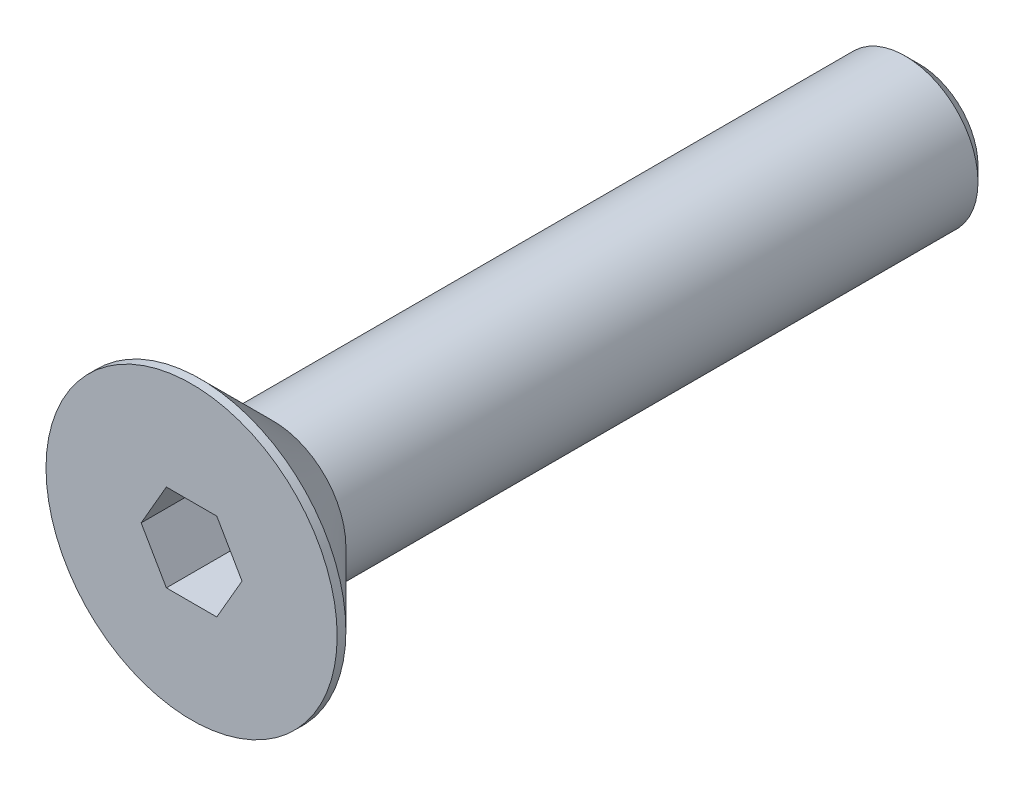
ISO-10303-21;
HEADER;
FILE_DESCRIPTION(('STEP AP214'),'2;1');
FILE_NAME('part.step','',(''),(''),'','','');
FILE_SCHEMA(('AUTOMOTIVE_DESIGN { 1 0 10303 214 1 1 1 1 }'));
ENDSEC;
DATA;
#1=APPLICATION_CONTEXT('core data for automotive mechanical design processes');
#2=APPLICATION_PROTOCOL_DEFINITION('international standard','automotive_design',2000,#1);
#3=PRODUCT_CONTEXT('',#1,'mechanical');
#4=PRODUCT('Part','Part','',(#3));
#5=PRODUCT_RELATED_PRODUCT_CATEGORY('part','',(#4));
#6=PRODUCT_DEFINITION_FORMATION('','',#4);
#7=PRODUCT_DEFINITION_CONTEXT('part definition',#1,'design');
#8=PRODUCT_DEFINITION('design','',#6,#7);
#9=PRODUCT_DEFINITION_SHAPE('','',#8);
#10=(LENGTH_UNIT() NAMED_UNIT(*) SI_UNIT(.MILLI.,.METRE.));
#11=(NAMED_UNIT(*) PLANE_ANGLE_UNIT() SI_UNIT($,.RADIAN.));
#12=(NAMED_UNIT(*) SI_UNIT($,.STERADIAN.) SOLID_ANGLE_UNIT());
#13=UNCERTAINTY_MEASURE_WITH_UNIT(LENGTH_MEASURE(1.E-05),#10,'distance_accuracy_value','');
#14=(GEOMETRIC_REPRESENTATION_CONTEXT(3) GLOBAL_UNCERTAINTY_ASSIGNED_CONTEXT((#13)) GLOBAL_UNIT_ASSIGNED_CONTEXT((#10,
#11,#12)) REPRESENTATION_CONTEXT('',''));
#15=CARTESIAN_POINT('',(0.,0.,0.));
#16=DIRECTION('',(0.,0.,1.));
#17=DIRECTION('',(1.,0.,0.));
#18=AXIS2_PLACEMENT_3D('',#15,#16,#17);
#19=CARTESIAN_POINT('',(-3.88578058618805E-13,4.44089209850063E-13,2.80000000000058));
#20=DIRECTION('',(0.,0.,1.));
#21=DIRECTION('',(-1.00000000000003,0.,0.));
#22=AXIS2_PLACEMENT_3D('',#19,#20,#21);
#23=PLANE('',#22);
#24=CARTESIAN_POINT('',(-3.88578058618805E-13,4.44089209850063E-13,2.80000000000058));
#25=DIRECTION('',(0.,0.,1.));
#26=DIRECTION('',(1.00000000000003,0.,0.));
#27=AXIS2_PLACEMENT_3D('',#24,#25,#26);
#28=CIRCLE('',#27,5.);
#29=CARTESIAN_POINT('',(5.00000000000045,-1.66533453693773E-12,2.80000000000047));
#30=VERTEX_POINT('',#29);
#31=EDGE_CURVE('E11',#30,#30,#28,.T.);
#32=ORIENTED_EDGE('',*,*,#31,.T.);
#33=EDGE_LOOP('',(#32));
#34=FACE_BOUND('',#33,.T.);
#35=DIRECTION('',(-1.00000000000003,0.,0.));
#36=VECTOR('',#35,1.);
#37=CARTESIAN_POINT('',(0.216506350949941,-1.50000000000161,2.79999999999947));
#38=LINE('',#37,#36);
#39=CARTESIAN_POINT('',(0.86602540379932,-1.5000000000015,2.7999999999993));
#40=VERTEX_POINT('',#39);
#41=CARTESIAN_POINT('',(-0.866025403799708,-1.50000000000106,2.79999999999914));
#42=VERTEX_POINT('',#41);
#43=EDGE_CURVE('E97',#40,#42,#38,.T.);
#44=ORIENTED_EDGE('',*,*,#43,.T.);
#45=DIRECTION('',(-0.500000000006758,0.866025403780579,0.));
#46=VECTOR('',#45,1.);
#47=CARTESIAN_POINT('',(-1.29903810569393,-0.75000000001102,2.7999999999993));
#48=LINE('',#47,#46);
#49=CARTESIAN_POINT('',(-1.73205080759931,1.11022302462516E-13,2.80000000000152));
#50=VERTEX_POINT('',#49);
#51=EDGE_CURVE('E157',#42,#50,#48,.T.);
#52=ORIENTED_EDGE('',*,*,#51,.T.);
#53=DIRECTION('',(0.500000000006745,0.866025403780568,0.));
#54=VECTOR('',#53,1.);
#55=CARTESIAN_POINT('',(-1.29903810569465,0.750000000008244,2.79999999999903));
#56=LINE('',#55,#54);
#57=CARTESIAN_POINT('',(-0.866025403799209,1.49999999999773,2.79999999999969));
#58=VERTEX_POINT('',#57);
#59=EDGE_CURVE('E142',#50,#58,#56,.T.);
#60=ORIENTED_EDGE('',*,*,#59,.T.);
#61=DIRECTION('',(1.00000000000003,0.,0.));
#62=VECTOR('',#61,1.);
#63=CARTESIAN_POINT('',(1.66533453693773E-13,1.49999999999773,2.79999999999991));
#64=LINE('',#63,#62);
#65=CARTESIAN_POINT('',(0.866025403799375,1.49999999999872,2.80000000000075));
#66=VERTEX_POINT('',#65);
#67=EDGE_CURVE('E131',#58,#66,#64,.T.);
#68=ORIENTED_EDGE('',*,*,#67,.T.);
#69=DIRECTION('',(0.500000000006758,-0.866025403780579,0.));
#70=VECTOR('',#69,1.);
#71=CARTESIAN_POINT('',(1.29903810569393,0.750000000010798,2.80000000000052));
#72=LINE('',#71,#70);
#73=CARTESIAN_POINT('',(1.73205080759986,-5.55111512312578E-13,2.79999999999986));
#74=VERTEX_POINT('',#73);
#75=EDGE_CURVE('E168',#66,#74,#72,.T.);
#76=ORIENTED_EDGE('',*,*,#75,.T.);
#77=DIRECTION('',(-0.500000000006745,-0.866025403780568,0.));
#78=VECTOR('',#77,1.);
#79=CARTESIAN_POINT('',(1.29903810569421,-0.750000000010242,2.80000000000041));
#80=LINE('',#79,#78);
#81=EDGE_CURVE('E20',#74,#40,#80,.T.);
#82=ORIENTED_EDGE('',*,*,#81,.T.);
#83=EDGE_LOOP('',(#44,#52,#60,#68,#76,#82));
#84=FACE_BOUND('',#83,.T.);
#85=ADVANCED_FACE('F16',(#34,#84),#23,.T.);
#86=CARTESIAN_POINT('',(-1.22124532708767E-12,-1.33226762955019E-12,1.40000000000023));
#87=DIRECTION('',(0.,0.,1.));
#88=DIRECTION('',(1.00000000000003,0.,0.));
#89=AXIS2_PLACEMENT_3D('',#86,#87,#88);
#90=CYLINDRICAL_SURFACE('',#89,5.);
#91=ORIENTED_EDGE('',*,*,#31,.F.);
#92=EDGE_LOOP('',(#91));
#93=FACE_BOUND('',#92,.T.);
#94=CARTESIAN_POINT('',(-2.22044604925031E-13,-1.55431223447522E-12,2.49999999999984));
#95=DIRECTION('',(0.,0.,1.));
#96=DIRECTION('',(1.00000000000003,0.,0.));
#97=AXIS2_PLACEMENT_3D('',#94,#95,#96);
#98=CIRCLE('',#97,5.);
#99=CARTESIAN_POINT('',(4.99999999999956,-1.4432899320127E-12,2.49999999999928));
#100=VERTEX_POINT('',#99);
#101=EDGE_CURVE('E27',#100,#100,#98,.T.);
#102=ORIENTED_EDGE('',*,*,#101,.T.);
#103=EDGE_LOOP('',(#102));
#104=FACE_BOUND('',#103,.T.);
#105=ADVANCED_FACE('F189',(#93,#104),#90,.T.);
#106=CARTESIAN_POINT('',(-3.88578058618805E-13,-2.66453525910038E-12,1.2499999999992));
#107=DIRECTION('',(0.,0.,1.));
#108=DIRECTION('',(1.00000000000003,0.,0.));
#109=AXIS2_PLACEMENT_3D('',#106,#107,#108);
#110=CONICAL_SURFACE('',#109,3.75,0.785398163397448);
#111=CARTESIAN_POINT('',(0.,0.,0.));
#112=DIRECTION('',(0.,0.,-1.));
#113=DIRECTION('',(1.00000000000003,0.,0.));
#114=AXIS2_PLACEMENT_3D('',#111,#112,#113);
#115=CIRCLE('',#114,2.5);
#116=CARTESIAN_POINT('',(2.50000000000172,2.22044604925031E-13,-6.10622663543836E-13));
#117=VERTEX_POINT('',#116);
#118=EDGE_CURVE('E136',#117,#117,#115,.T.);
#119=ORIENTED_EDGE('',*,*,#118,.F.);
#120=EDGE_LOOP('',(#119));
#121=FACE_BOUND('',#120,.T.);
#122=ORIENTED_EDGE('',*,*,#101,.F.);
#123=EDGE_LOOP('',(#122));
#124=FACE_BOUND('',#123,.T.);
#125=ADVANCED_FACE('F18',(#121,#124),#110,.T.);
#126=CARTESIAN_POINT('',(-4.9960036108132E-13,-9.99200722162641E-13,-22.1999999999994));
#127=DIRECTION('',(0.,0.,-1.));
#128=DIRECTION('',(1.00000000000003,0.,0.));
#129=AXIS2_PLACEMENT_3D('',#126,#127,#128);
#130=PLANE('',#129);
#131=CARTESIAN_POINT('',(-4.9960036108132E-13,-9.99200722162641E-13,-22.1999999999994));
#132=DIRECTION('',(0.,0.,-1.));
#133=DIRECTION('',(1.00000000000003,0.,0.));
#134=AXIS2_PLACEMENT_3D('',#131,#132,#133);
#135=CIRCLE('',#134,2.00925);
#136=CARTESIAN_POINT('',(2.00924999999996,-8.88178419700125E-13,-22.2000000000003));
#137=VERTEX_POINT('',#136);
#138=EDGE_CURVE('E60',#137,#137,#135,.T.);
#139=ORIENTED_EDGE('',*,*,#138,.T.);
#140=EDGE_LOOP('',(#139));
#141=FACE_BOUND('',#140,.T.);
#142=ADVANCED_FACE('F206',(#141),#130,.T.);
#143=CARTESIAN_POINT('',(-1.11022302462516E-13,1.22124532708767E-12,-9.69999999999987));
#144=DIRECTION('',(0.,0.,1.));
#145=DIRECTION('',(1.00000000000003,0.,0.));
#146=AXIS2_PLACEMENT_3D('',#143,#144,#145);
#147=CYLINDRICAL_SURFACE('',#146,2.5);
#148=ORIENTED_EDGE('',*,*,#118,.T.);
#149=EDGE_LOOP('',(#148));
#150=FACE_BOUND('',#149,.T.);
#151=CARTESIAN_POINT('',(-3.33066907387547E-13,-3.33066907387547E-13,-21.7092499999997));
#152=DIRECTION('',(0.,0.,1.));
#153=DIRECTION('',(1.00000000000003,0.,0.));
#154=AXIS2_PLACEMENT_3D('',#151,#152,#153);
#155=CIRCLE('',#154,2.5);
#156=CARTESIAN_POINT('',(2.50000000000039,6.66133814775094E-13,-21.7092499999993));
#157=VERTEX_POINT('',#156);
#158=EDGE_CURVE('E67',#157,#157,#155,.T.);
#159=ORIENTED_EDGE('',*,*,#158,.T.);
#160=EDGE_LOOP('',(#159));
#161=FACE_BOUND('',#160,.T.);
#162=ADVANCED_FACE('F202',(#150,#161),#147,.T.);
#163=CARTESIAN_POINT('',(-8.32667268468867E-13,-2.22044604925031E-13,-21.9546250000011));
#164=DIRECTION('',(0.,0.,1.));
#165=DIRECTION('',(1.00000000000003,0.,0.));
#166=AXIS2_PLACEMENT_3D('',#163,#164,#165);
#167=CONICAL_SURFACE('',#166,2.254625,0.78539816339745);
#168=ORIENTED_EDGE('',*,*,#138,.F.);
#169=EDGE_LOOP('',(#168));
#170=FACE_BOUND('',#169,.T.);
#171=ORIENTED_EDGE('',*,*,#158,.F.);
#172=EDGE_LOOP('',(#171));
#173=FACE_BOUND('',#172,.T.);
#174=ADVANCED_FACE('F205',(#170,#173),#167,.T.);
#175=CARTESIAN_POINT('',(5.55111512312578E-13,-9.99200722162641E-13,0.499999999998724));
#176=DIRECTION('',(0.,0.,-1.));
#177=DIRECTION('',(0.,-1.00000000000003,0.));
#178=AXIS2_PLACEMENT_3D('',#175,#176,#177);
#179=PLANE('',#178);
#180=DIRECTION('',(1.00000000000003,0.,0.));
#181=VECTOR('',#180,1.);
#182=CARTESIAN_POINT('',(-1.11022302462516E-13,-1.50000000000006,0.500000000000111));
#183=LINE('',#182,#181);
#184=CARTESIAN_POINT('',(-0.866025403799209,-1.50000000000206,0.49999999999939));
#185=VERTEX_POINT('',#184);
#186=CARTESIAN_POINT('',(0.866025403800263,-1.50000000000095,0.499999999999834));
#187=VERTEX_POINT('',#186);
#188=EDGE_CURVE('E84',#185,#187,#183,.T.);
#189=ORIENTED_EDGE('',*,*,#188,.T.);
#190=DIRECTION('',(0.500000000006745,0.866025403780568,0.));
#191=VECTOR('',#190,1.);
#192=CARTESIAN_POINT('',(1.73205080759969,-5.55111512312578E-13,0.499999999999778));
#193=LINE('',#192,#191);
#194=CARTESIAN_POINT('',(1.73205080759969,-5.55111512312578E-13,0.499999999999778));
#195=VERTEX_POINT('',#194);
#196=EDGE_CURVE('E88',#187,#195,#193,.T.);
#197=ORIENTED_EDGE('',*,*,#196,.T.);
#198=DIRECTION('',(-0.500000000006758,0.866025403780577,0.));
#199=VECTOR('',#198,1.);
#200=CARTESIAN_POINT('',(0.866025403799819,1.4999999999995,0.500000000000111));
#201=LINE('',#200,#199);
#202=CARTESIAN_POINT('',(0.866025403799819,1.4999999999995,0.500000000000111));
#203=VERTEX_POINT('',#202);
#204=EDGE_CURVE('E128',#195,#203,#201,.T.);
#205=ORIENTED_EDGE('',*,*,#204,.T.);
#206=DIRECTION('',(-1.00000000000003,0.,0.));
#207=VECTOR('',#206,1.);
#208=CARTESIAN_POINT('',(-0.866025403799819,1.4999999999985,0.499999999999279));
#209=LINE('',#208,#207);
#210=CARTESIAN_POINT('',(-0.866025403799819,1.4999999999985,0.499999999999279));
#211=VERTEX_POINT('',#210);
#212=EDGE_CURVE('E120',#203,#211,#209,.T.);
#213=ORIENTED_EDGE('',*,*,#212,.T.);
#214=DIRECTION('',(-0.500000000006745,-0.866025403780568,0.));
#215=VECTOR('',#214,1.);
#216=CARTESIAN_POINT('',(-1.73205080759942,-9.99200722162641E-13,0.499999999999279));
#217=LINE('',#216,#215);
#218=CARTESIAN_POINT('',(-1.73205080759942,-9.99200722162641E-13,0.499999999999279));
#219=VERTEX_POINT('',#218);
#220=EDGE_CURVE('E141',#211,#219,#217,.T.);
#221=ORIENTED_EDGE('',*,*,#220,.T.);
#222=DIRECTION('',(0.500000000006758,-0.866025403780577,0.));
#223=VECTOR('',#222,1.);
#224=CARTESIAN_POINT('',(-0.866025403799209,-1.50000000000206,0.49999999999939));
#225=LINE('',#224,#223);
#226=EDGE_CURVE('E91',#219,#185,#225,.T.);
#227=ORIENTED_EDGE('',*,*,#226,.T.);
#228=EDGE_LOOP('',(#189,#197,#205,#213,#221,#227));
#229=FACE_BOUND('',#228,.T.);
#230=ADVANCED_FACE('F86',(#229),#179,.F.);
#231=CARTESIAN_POINT('',(-1.29903810570087,-0.750000000000806,3.80000000000086));
#232=DIRECTION('',(-0.866025403780567,-0.500000000006743,0.));
#233=DIRECTION('',(-0.500000000006758,0.866025403780579,0.));
#234=AXIS2_PLACEMENT_3D('',#231,#232,#233);
#235=PLANE('',#234);
#236=ORIENTED_EDGE('',*,*,#51,.F.);
#237=DIRECTION('',(0.,0.,-1.));
#238=VECTOR('',#237,1.);
#239=CARTESIAN_POINT('',(-0.866025403801041,-1.50000000000095,3.80000000000003));
#240=LINE('',#239,#238);
#241=EDGE_CURVE('E96',#42,#185,#240,.T.);
#242=ORIENTED_EDGE('',*,*,#241,.T.);
#243=ORIENTED_EDGE('',*,*,#226,.F.);
#244=DIRECTION('',(0.,0.,-1.));
#245=VECTOR('',#244,1.);
#246=CARTESIAN_POINT('',(-1.73205080760108,-3.33066907387547E-13,3.7999999999988));
#247=LINE('',#246,#245);
#248=EDGE_CURVE('E138',#50,#219,#247,.T.);
#249=ORIENTED_EDGE('',*,*,#248,.F.);
#250=EDGE_LOOP('',(#236,#242,#243,#249));
#251=FACE_BOUND('',#250,.T.);
#252=ADVANCED_FACE('F187',(#251),#235,.F.);
#253=CARTESIAN_POINT('',(-1.29903810569942,0.749999999998252,3.79999999999941));
#254=DIRECTION('',(-0.866025403780575,0.500000000006762,0.));
#255=DIRECTION('',(0.500000000006747,0.866025403780568,0.));
#256=AXIS2_PLACEMENT_3D('',#253,#254,#255);
#257=PLANE('',#256);
#258=ORIENTED_EDGE('',*,*,#59,.F.);
#259=ORIENTED_EDGE('',*,*,#248,.T.);
#260=ORIENTED_EDGE('',*,*,#220,.F.);
#261=DIRECTION('',(0.,0.,-1.));
#262=VECTOR('',#261,1.);
#263=CARTESIAN_POINT('',(-0.866025403798765,1.49999999999839,3.80000000000036));
#264=LINE('',#263,#262);
#265=EDGE_CURVE('E125',#58,#211,#264,.T.);
#266=ORIENTED_EDGE('',*,*,#265,.F.);
#267=EDGE_LOOP('',(#258,#259,#260,#266));
#268=FACE_BOUND('',#267,.T.);
#269=ADVANCED_FACE('F186',(#268),#257,.F.);
#270=CARTESIAN_POINT('',(0.43301270190077,-1.50000000000161,3.80000000000019));
#271=DIRECTION('',(0.,-1.00000000000003,0.));
#272=DIRECTION('',(-1.00000000000003,0.,0.));
#273=AXIS2_PLACEMENT_3D('',#270,#271,#272);
#274=PLANE('',#273);
#275=ORIENTED_EDGE('',*,*,#43,.F.);
#276=DIRECTION('',(0.,0.,-1.));
#277=VECTOR('',#276,1.);
#278=CARTESIAN_POINT('',(0.866025403799042,-1.50000000000006,3.80000000000047));
#279=LINE('',#278,#277);
#280=EDGE_CURVE('E100',#40,#187,#279,.T.);
#281=ORIENTED_EDGE('',*,*,#280,.T.);
#282=ORIENTED_EDGE('',*,*,#188,.F.);
#283=ORIENTED_EDGE('',*,*,#241,.F.);
#284=EDGE_LOOP('',(#275,#281,#282,#283));
#285=FACE_BOUND('',#284,.T.);
#286=ADVANCED_FACE('F101',(#285),#274,.F.);
#287=CARTESIAN_POINT('',(1.29903810569942,-0.750000000002027,3.79999999999903));
#288=DIRECTION('',(0.866025403780575,-0.500000000006762,0.));
#289=DIRECTION('',(-0.500000000006747,-0.866025403780568,0.));
#290=AXIS2_PLACEMENT_3D('',#287,#288,#289);
#291=PLANE('',#290);
#292=ORIENTED_EDGE('',*,*,#81,.F.);
#293=DIRECTION('',(0.,0.,-1.));
#294=VECTOR('',#293,1.);
#295=CARTESIAN_POINT('',(1.73205080759892,-9.99200722162641E-13,3.79999999999808));
#296=LINE('',#295,#294);
#297=EDGE_CURVE('E110',#74,#195,#296,.T.);
#298=ORIENTED_EDGE('',*,*,#297,.T.);
#299=ORIENTED_EDGE('',*,*,#196,.F.);
#300=ORIENTED_EDGE('',*,*,#280,.F.);
#301=EDGE_LOOP('',(#292,#298,#299,#300));
#302=FACE_BOUND('',#301,.T.);
#303=ADVANCED_FACE('F108',(#302),#291,.F.);
#304=CARTESIAN_POINT('',(1.29903810570059,0.749999999999584,3.79999999999925));
#305=DIRECTION('',(0.866025403780567,0.500000000006743,0.));
#306=DIRECTION('',(0.500000000006758,-0.866025403780579,0.));
#307=AXIS2_PLACEMENT_3D('',#304,#305,#306);
#308=PLANE('',#307);
#309=ORIENTED_EDGE('',*,*,#75,.F.);
#310=DIRECTION('',(0.,0.,-1.));
#311=VECTOR('',#310,1.);
#312=CARTESIAN_POINT('',(0.86602540379993,1.49999999999906,3.79999999999997));
#313=LINE('',#312,#311);
#314=EDGE_CURVE('E124',#66,#203,#313,.T.);
#315=ORIENTED_EDGE('',*,*,#314,.T.);
#316=ORIENTED_EDGE('',*,*,#204,.F.);
#317=ORIENTED_EDGE('',*,*,#297,.F.);
#318=EDGE_LOOP('',(#309,#315,#316,#317));
#319=FACE_BOUND('',#318,.T.);
#320=ADVANCED_FACE('F180',(#319),#308,.F.);
#321=CARTESIAN_POINT('',(-1.0547118733939E-12,1.49999999999884,3.80000000000041));
#322=DIRECTION('',(0.,1.00000000000003,0.));
#323=DIRECTION('',(1.00000000000003,0.,0.));
#324=AXIS2_PLACEMENT_3D('',#321,#322,#323);
#325=PLANE('',#324);
#326=ORIENTED_EDGE('',*,*,#67,.F.);
#327=ORIENTED_EDGE('',*,*,#265,.T.);
#328=ORIENTED_EDGE('',*,*,#212,.F.);
#329=ORIENTED_EDGE('',*,*,#314,.F.);
#330=EDGE_LOOP('',(#326,#327,#328,#329));
#331=FACE_BOUND('',#330,.T.);
#332=ADVANCED_FACE('F184',(#331),#325,.F.);
#333=CLOSED_SHELL('',(#85,#105,#125,#142,#162,#174,#230,#252,#269,#286,#303,#320,#332));
#334=MANIFOLD_SOLID_BREP('B1',#333);
#335=ADVANCED_BREP_SHAPE_REPRESENTATION('',(#18,#334),#14);
#336=SHAPE_DEFINITION_REPRESENTATION(#9,#335);
ENDSEC;
END-ISO-10303-21;
